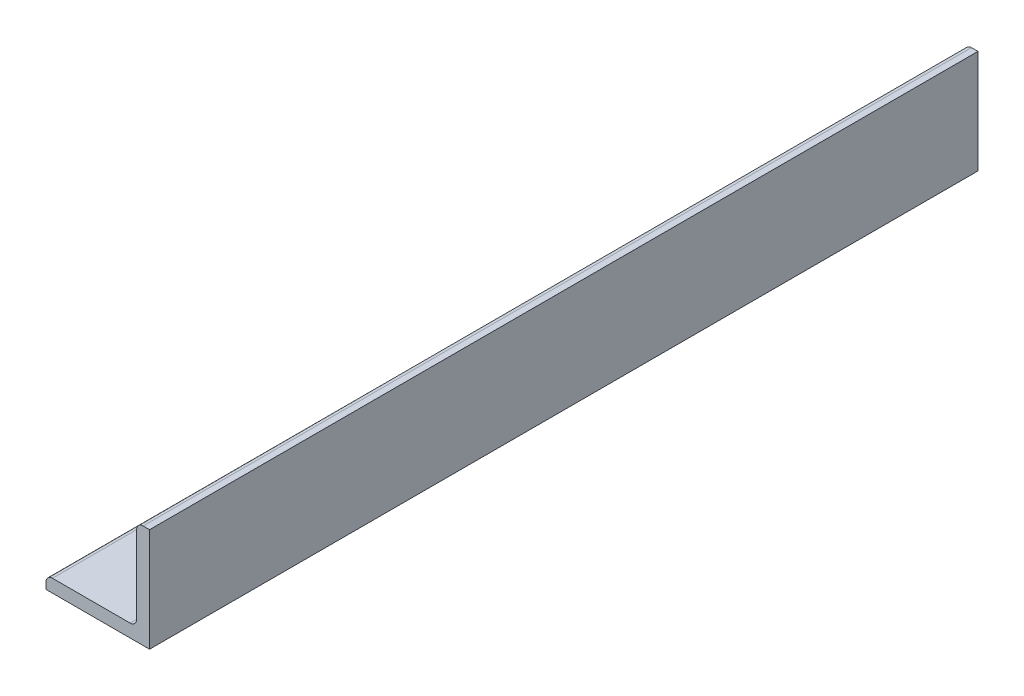
ISO-10303-21;
HEADER;
FILE_DESCRIPTION(('STEP AP214'),'2;1');
FILE_NAME('part.step','',(''),(''),'','','');
FILE_SCHEMA(('AUTOMOTIVE_DESIGN { 1 0 10303 214 1 1 1 1 }'));
ENDSEC;
DATA;
#1=APPLICATION_CONTEXT('core data for automotive mechanical design processes');
#2=APPLICATION_PROTOCOL_DEFINITION('international standard','automotive_design',2000,#1);
#3=PRODUCT_CONTEXT('',#1,'mechanical');
#4=PRODUCT('Part','Part','',(#3));
#5=PRODUCT_RELATED_PRODUCT_CATEGORY('part','',(#4));
#6=PRODUCT_DEFINITION_FORMATION('','',#4);
#7=PRODUCT_DEFINITION_CONTEXT('part definition',#1,'design');
#8=PRODUCT_DEFINITION('design','',#6,#7);
#9=PRODUCT_DEFINITION_SHAPE('','',#8);
#10=(LENGTH_UNIT() NAMED_UNIT(*) SI_UNIT(.MILLI.,.METRE.));
#11=(NAMED_UNIT(*) PLANE_ANGLE_UNIT() SI_UNIT($,.RADIAN.));
#12=(NAMED_UNIT(*) SI_UNIT($,.STERADIAN.) SOLID_ANGLE_UNIT());
#13=UNCERTAINTY_MEASURE_WITH_UNIT(LENGTH_MEASURE(1.E-05),#10,'distance_accuracy_value','');
#14=(GEOMETRIC_REPRESENTATION_CONTEXT(3) GLOBAL_UNCERTAINTY_ASSIGNED_CONTEXT((#13)) GLOBAL_UNIT_ASSIGNED_CONTEXT((#10,
#11,#12)) REPRESENTATION_CONTEXT('',''));
#15=CARTESIAN_POINT('',(0.,0.,0.));
#16=DIRECTION('',(0.,0.,1.));
#17=DIRECTION('',(1.,0.,0.));
#18=AXIS2_PLACEMENT_3D('',#15,#16,#17);
#19=CARTESIAN_POINT('',(-12.7,1.5875,101.6));
#20=DIRECTION('',(1.,0.,0.));
#21=DIRECTION('',(0.,0.,-1.));
#22=AXIS2_PLACEMENT_3D('',#19,#20,#21);
#23=PLANE('',#22);
#24=DIRECTION('',(0.,-1.,0.));
#25=VECTOR('',#24,1.);
#26=CARTESIAN_POINT('',(-12.7,1.5875,-101.6));
#27=LINE('',#26,#25);
#28=CARTESIAN_POINT('',(-12.7,1.5875,-101.6));
#29=VERTEX_POINT('',#28);
#30=CARTESIAN_POINT('',(-12.7,0.,-101.6));
#31=VERTEX_POINT('',#30);
#32=EDGE_CURVE('E146',#29,#31,#27,.T.);
#33=ORIENTED_EDGE('',*,*,#32,.T.);
#34=DIRECTION('',(0.,0.,-1.));
#35=VECTOR('',#34,1.);
#36=CARTESIAN_POINT('',(-12.7,0.,101.6));
#37=LINE('',#36,#35);
#38=CARTESIAN_POINT('',(-12.7,0.,101.6));
#39=VERTEX_POINT('',#38);
#40=EDGE_CURVE('E11',#39,#31,#37,.T.);
#41=ORIENTED_EDGE('',*,*,#40,.F.);
#42=DIRECTION('',(0.,-1.,0.));
#43=VECTOR('',#42,1.);
#44=CARTESIAN_POINT('',(-12.7,1.5875,101.6));
#45=LINE('',#44,#43);
#46=CARTESIAN_POINT('',(-12.7,1.5875,101.6));
#47=VERTEX_POINT('',#46);
#48=EDGE_CURVE('E171',#47,#39,#45,.T.);
#49=ORIENTED_EDGE('',*,*,#48,.F.);
#50=DIRECTION('',(0.,0.,-1.));
#51=VECTOR('',#50,1.);
#52=CARTESIAN_POINT('',(-12.7,1.5875,101.6));
#53=LINE('',#52,#51);
#54=EDGE_CURVE('E142',#47,#29,#53,.T.);
#55=ORIENTED_EDGE('',*,*,#54,.T.);
#56=EDGE_LOOP('',(#33,#41,#49,#55));
#57=FACE_BOUND('',#56,.T.);
#58=ADVANCED_FACE('F39',(#57),#23,.F.);
#59=CARTESIAN_POINT('',(-12.7,0.,101.6));
#60=DIRECTION('',(0.,1.,0.));
#61=DIRECTION('',(0.,0.,1.));
#62=AXIS2_PLACEMENT_3D('',#59,#60,#61);
#63=PLANE('',#62);
#64=DIRECTION('',(1.,0.,0.));
#65=VECTOR('',#64,1.);
#66=CARTESIAN_POINT('',(-12.7,0.,-101.6));
#67=LINE('',#66,#65);
#68=CARTESIAN_POINT('',(12.7,0.,-101.6));
#69=VERTEX_POINT('',#68);
#70=EDGE_CURVE('E150',#31,#69,#67,.T.);
#71=ORIENTED_EDGE('',*,*,#70,.T.);
#72=DIRECTION('',(0.,0.,-1.));
#73=VECTOR('',#72,1.);
#74=CARTESIAN_POINT('',(12.7,0.,101.6));
#75=LINE('',#74,#73);
#76=CARTESIAN_POINT('',(12.7,0.,101.6));
#77=VERTEX_POINT('',#76);
#78=EDGE_CURVE('E48',#77,#69,#75,.T.);
#79=ORIENTED_EDGE('',*,*,#78,.F.);
#80=DIRECTION('',(1.,0.,0.));
#81=VECTOR('',#80,1.);
#82=CARTESIAN_POINT('',(-12.7,0.,101.6));
#83=LINE('',#82,#81);
#84=EDGE_CURVE('E102',#39,#77,#83,.T.);
#85=ORIENTED_EDGE('',*,*,#84,.F.);
#86=ORIENTED_EDGE('',*,*,#40,.T.);
#87=EDGE_LOOP('',(#71,#79,#85,#86));
#88=FACE_BOUND('',#87,.T.);
#89=ADVANCED_FACE('F227',(#88),#63,.F.);
#90=CARTESIAN_POINT('',(12.7,0.,101.6));
#91=DIRECTION('',(-1.,0.,0.));
#92=DIRECTION('',(0.,-1.,0.));
#93=AXIS2_PLACEMENT_3D('',#90,#91,#92);
#94=PLANE('',#93);
#95=DIRECTION('',(0.,1.,0.));
#96=VECTOR('',#95,1.);
#97=CARTESIAN_POINT('',(12.7,0.,-101.6));
#98=LINE('',#97,#96);
#99=CARTESIAN_POINT('',(12.7,25.4,-101.6));
#100=VERTEX_POINT('',#99);
#101=EDGE_CURVE('E153',#69,#100,#98,.T.);
#102=ORIENTED_EDGE('',*,*,#101,.T.);
#103=DIRECTION('',(0.,0.,-1.));
#104=VECTOR('',#103,1.);
#105=CARTESIAN_POINT('',(12.7,25.4,101.6));
#106=LINE('',#105,#104);
#107=CARTESIAN_POINT('',(12.7,25.4,101.6));
#108=VERTEX_POINT('',#107);
#109=EDGE_CURVE('E186',#108,#100,#106,.T.);
#110=ORIENTED_EDGE('',*,*,#109,.F.);
#111=DIRECTION('',(0.,1.,0.));
#112=VECTOR('',#111,1.);
#113=CARTESIAN_POINT('',(12.7,0.,101.6));
#114=LINE('',#113,#112);
#115=EDGE_CURVE('E196',#77,#108,#114,.T.);
#116=ORIENTED_EDGE('',*,*,#115,.F.);
#117=ORIENTED_EDGE('',*,*,#78,.T.);
#118=EDGE_LOOP('',(#102,#110,#116,#117));
#119=FACE_BOUND('',#118,.T.);
#120=ADVANCED_FACE('F194',(#119),#94,.F.);
#121=CARTESIAN_POINT('',(11.1125,25.4,101.6));
#122=DIRECTION('',(0.,-1.,0.));
#123=DIRECTION('',(1.,0.,0.));
#124=AXIS2_PLACEMENT_3D('',#121,#122,#123);
#125=PLANE('',#124);
#126=DIRECTION('',(-1.,0.,0.));
#127=VECTOR('',#126,1.);
#128=CARTESIAN_POINT('',(11.1125,25.4,-101.6));
#129=LINE('',#128,#127);
#130=CARTESIAN_POINT('',(11.1125,25.4,-101.6));
#131=VERTEX_POINT('',#130);
#132=EDGE_CURVE('E156',#100,#131,#129,.T.);
#133=ORIENTED_EDGE('',*,*,#132,.T.);
#134=DIRECTION('',(0.,0.,-1.));
#135=VECTOR('',#134,1.);
#136=CARTESIAN_POINT('',(11.1125,25.4,101.6));
#137=LINE('',#136,#135);
#138=CARTESIAN_POINT('',(11.1125,25.4,101.6));
#139=VERTEX_POINT('',#138);
#140=EDGE_CURVE('E182',#139,#131,#137,.T.);
#141=ORIENTED_EDGE('',*,*,#140,.F.);
#142=DIRECTION('',(-1.,0.,0.));
#143=VECTOR('',#142,1.);
#144=CARTESIAN_POINT('',(11.1125,25.4,101.6));
#145=LINE('',#144,#143);
#146=EDGE_CURVE('E213',#108,#139,#145,.T.);
#147=ORIENTED_EDGE('',*,*,#146,.F.);
#148=ORIENTED_EDGE('',*,*,#109,.T.);
#149=EDGE_LOOP('',(#133,#141,#147,#148));
#150=FACE_BOUND('',#149,.T.);
#151=ADVANCED_FACE('F205',(#150),#125,.F.);
#152=CARTESIAN_POINT('',(11.1125,23.8125,101.6));
#153=DIRECTION('',(0.,0.,-1.));
#154=DIRECTION('',(-1.,0.,0.));
#155=AXIS2_PLACEMENT_3D('',#152,#153,#154);
#156=CYLINDRICAL_SURFACE('',#155,1.5875);
#157=CARTESIAN_POINT('',(11.1125,23.8125,-101.6));
#158=DIRECTION('',(0.,0.,1.));
#159=DIRECTION('',(-1.,0.,0.));
#160=AXIS2_PLACEMENT_3D('',#157,#158,#159);
#161=CIRCLE('',#160,1.5875);
#162=CARTESIAN_POINT('',(9.525,23.8125,-101.6));
#163=VERTEX_POINT('',#162);
#164=EDGE_CURVE('E159',#131,#163,#161,.T.);
#165=ORIENTED_EDGE('',*,*,#164,.T.);
#166=DIRECTION('',(0.,0.,-1.));
#167=VECTOR('',#166,1.);
#168=CARTESIAN_POINT('',(9.525,23.8125,101.6));
#169=LINE('',#168,#167);
#170=CARTESIAN_POINT('',(9.525,23.8125,101.6));
#171=VERTEX_POINT('',#170);
#172=EDGE_CURVE('E178',#171,#163,#169,.T.);
#173=ORIENTED_EDGE('',*,*,#172,.F.);
#174=CARTESIAN_POINT('',(11.1125,23.8125,101.6));
#175=DIRECTION('',(0.,0.,1.));
#176=DIRECTION('',(-1.,0.,0.));
#177=AXIS2_PLACEMENT_3D('',#174,#175,#176);
#178=CIRCLE('',#177,1.5875);
#179=EDGE_CURVE('E211',#139,#171,#178,.T.);
#180=ORIENTED_EDGE('',*,*,#179,.F.);
#181=ORIENTED_EDGE('',*,*,#140,.T.);
#182=EDGE_LOOP('',(#165,#173,#180,#181));
#183=FACE_BOUND('',#182,.T.);
#184=ADVANCED_FACE('F209',(#183),#156,.T.);
#185=CARTESIAN_POINT('',(9.525,23.8125,101.6));
#186=DIRECTION('',(1.,0.,0.));
#187=DIRECTION('',(0.,1.,0.));
#188=AXIS2_PLACEMENT_3D('',#185,#186,#187);
#189=PLANE('',#188);
#190=DIRECTION('',(0.,-1.,0.));
#191=VECTOR('',#190,1.);
#192=CARTESIAN_POINT('',(9.525,23.8125,-101.6));
#193=LINE('',#192,#191);
#194=CARTESIAN_POINT('',(9.525,4.7625,-101.6));
#195=VERTEX_POINT('',#194);
#196=EDGE_CURVE('E162',#163,#195,#193,.T.);
#197=ORIENTED_EDGE('',*,*,#196,.T.);
#198=DIRECTION('',(0.,0.,-1.));
#199=VECTOR('',#198,1.);
#200=CARTESIAN_POINT('',(9.525,4.7625,101.6));
#201=LINE('',#200,#199);
#202=CARTESIAN_POINT('',(9.525,4.7625,101.6));
#203=VERTEX_POINT('',#202);
#204=EDGE_CURVE('E135',#203,#195,#201,.T.);
#205=ORIENTED_EDGE('',*,*,#204,.F.);
#206=DIRECTION('',(0.,-1.,0.));
#207=VECTOR('',#206,1.);
#208=CARTESIAN_POINT('',(9.525,23.8125,101.6));
#209=LINE('',#208,#207);
#210=EDGE_CURVE('E124',#171,#203,#209,.T.);
#211=ORIENTED_EDGE('',*,*,#210,.F.);
#212=ORIENTED_EDGE('',*,*,#172,.T.);
#213=EDGE_LOOP('',(#197,#205,#211,#212));
#214=FACE_BOUND('',#213,.T.);
#215=ADVANCED_FACE('F239',(#214),#189,.F.);
#216=CARTESIAN_POINT('',(7.93750000000001,4.7625,101.6));
#217=DIRECTION('',(0.,0.,-1.));
#218=DIRECTION('',(-1.,0.,0.));
#219=AXIS2_PLACEMENT_3D('',#216,#217,#218);
#220=CYLINDRICAL_SURFACE('',#219,1.5875);
#221=CARTESIAN_POINT('',(7.93750000000001,4.7625,-101.6));
#222=DIRECTION('',(0.,0.,-1.));
#223=DIRECTION('',(-1.,0.,0.));
#224=AXIS2_PLACEMENT_3D('',#221,#222,#223);
#225=CIRCLE('',#224,1.5875);
#226=CARTESIAN_POINT('',(7.9375,3.175,-101.6));
#227=VERTEX_POINT('',#226);
#228=EDGE_CURVE('E133',#195,#227,#225,.T.);
#229=ORIENTED_EDGE('',*,*,#228,.T.);
#230=DIRECTION('',(0.,0.,-1.));
#231=VECTOR('',#230,1.);
#232=CARTESIAN_POINT('',(7.9375,3.175,101.6));
#233=LINE('',#232,#231);
#234=CARTESIAN_POINT('',(7.9375,3.175,101.6));
#235=VERTEX_POINT('',#234);
#236=EDGE_CURVE('E130',#235,#227,#233,.T.);
#237=ORIENTED_EDGE('',*,*,#236,.F.);
#238=CARTESIAN_POINT('',(7.93750000000001,4.7625,101.6));
#239=DIRECTION('',(0.,0.,-1.));
#240=DIRECTION('',(-1.,0.,0.));
#241=AXIS2_PLACEMENT_3D('',#238,#239,#240);
#242=CIRCLE('',#241,1.5875);
#243=EDGE_CURVE('E118',#203,#235,#242,.T.);
#244=ORIENTED_EDGE('',*,*,#243,.F.);
#245=ORIENTED_EDGE('',*,*,#204,.T.);
#246=EDGE_LOOP('',(#229,#237,#244,#245));
#247=FACE_BOUND('',#246,.T.);
#248=ADVANCED_FACE('F131',(#247),#220,.F.);
#249=CARTESIAN_POINT('',(7.9375,3.175,101.6));
#250=DIRECTION('',(0.,-1.,0.));
#251=DIRECTION('',(1.,0.,0.));
#252=AXIS2_PLACEMENT_3D('',#249,#250,#251);
#253=PLANE('',#252);
#254=DIRECTION('',(-1.,0.,0.));
#255=VECTOR('',#254,1.);
#256=CARTESIAN_POINT('',(7.9375,3.175,-101.6));
#257=LINE('',#256,#255);
#258=CARTESIAN_POINT('',(-11.1125,3.175,-101.6));
#259=VERTEX_POINT('',#258);
#260=EDGE_CURVE('E88',#227,#259,#257,.T.);
#261=ORIENTED_EDGE('',*,*,#260,.T.);
#262=DIRECTION('',(0.,0.,-1.));
#263=VECTOR('',#262,1.);
#264=CARTESIAN_POINT('',(-11.1125,3.175,101.6));
#265=LINE('',#264,#263);
#266=CARTESIAN_POINT('',(-11.1125,3.175,101.6));
#267=VERTEX_POINT('',#266);
#268=EDGE_CURVE('E136',#267,#259,#265,.T.);
#269=ORIENTED_EDGE('',*,*,#268,.F.);
#270=DIRECTION('',(-1.,0.,0.));
#271=VECTOR('',#270,1.);
#272=CARTESIAN_POINT('',(7.9375,3.175,101.6));
#273=LINE('',#272,#271);
#274=EDGE_CURVE('E122',#235,#267,#273,.T.);
#275=ORIENTED_EDGE('',*,*,#274,.F.);
#276=ORIENTED_EDGE('',*,*,#236,.T.);
#277=EDGE_LOOP('',(#261,#269,#275,#276));
#278=FACE_BOUND('',#277,.T.);
#279=ADVANCED_FACE('F138',(#278),#253,.F.);
#280=CARTESIAN_POINT('',(-11.1125,1.5875,101.6));
#281=DIRECTION('',(0.,0.,-1.));
#282=DIRECTION('',(-1.,0.,0.));
#283=AXIS2_PLACEMENT_3D('',#280,#281,#282);
#284=CYLINDRICAL_SURFACE('',#283,1.5875);
#285=CARTESIAN_POINT('',(-11.1125,1.5875,-101.6));
#286=DIRECTION('',(0.,0.,1.));
#287=DIRECTION('',(-1.,0.,0.));
#288=AXIS2_PLACEMENT_3D('',#285,#286,#287);
#289=CIRCLE('',#288,1.5875);
#290=EDGE_CURVE('E94',#259,#29,#289,.T.);
#291=ORIENTED_EDGE('',*,*,#290,.T.);
#292=ORIENTED_EDGE('',*,*,#54,.F.);
#293=CARTESIAN_POINT('',(-11.1125,1.5875,101.6));
#294=DIRECTION('',(0.,0.,1.));
#295=DIRECTION('',(-1.,0.,0.));
#296=AXIS2_PLACEMENT_3D('',#293,#294,#295);
#297=CIRCLE('',#296,1.5875);
#298=EDGE_CURVE('E56',#267,#47,#297,.T.);
#299=ORIENTED_EDGE('',*,*,#298,.F.);
#300=ORIENTED_EDGE('',*,*,#268,.T.);
#301=EDGE_LOOP('',(#291,#292,#299,#300));
#302=FACE_BOUND('',#301,.T.);
#303=ADVANCED_FACE('F247',(#302),#284,.T.);
#304=CARTESIAN_POINT('',(11.1125,23.8125,101.6));
#305=DIRECTION('',(0.,0.,-1.));
#306=DIRECTION('',(-1.,0.,0.));
#307=AXIS2_PLACEMENT_3D('',#304,#305,#306);
#308=PLANE('',#307);
#309=ORIENTED_EDGE('',*,*,#48,.T.);
#310=ORIENTED_EDGE('',*,*,#84,.T.);
#311=ORIENTED_EDGE('',*,*,#115,.T.);
#312=ORIENTED_EDGE('',*,*,#146,.T.);
#313=ORIENTED_EDGE('',*,*,#179,.T.);
#314=ORIENTED_EDGE('',*,*,#210,.T.);
#315=ORIENTED_EDGE('',*,*,#243,.T.);
#316=ORIENTED_EDGE('',*,*,#274,.T.);
#317=ORIENTED_EDGE('',*,*,#298,.T.);
#318=EDGE_LOOP('',(#309,#310,#311,#312,#313,#314,#315,#316,#317));
#319=FACE_BOUND('',#318,.T.);
#320=ADVANCED_FACE('F120',(#319),#308,.F.);
#321=CARTESIAN_POINT('',(11.1125,23.8125,-101.6));
#322=DIRECTION('',(0.,0.,-1.));
#323=DIRECTION('',(-1.,0.,0.));
#324=AXIS2_PLACEMENT_3D('',#321,#322,#323);
#325=PLANE('',#324);
#326=ORIENTED_EDGE('',*,*,#32,.F.);
#327=ORIENTED_EDGE('',*,*,#290,.F.);
#328=ORIENTED_EDGE('',*,*,#260,.F.);
#329=ORIENTED_EDGE('',*,*,#228,.F.);
#330=ORIENTED_EDGE('',*,*,#196,.F.);
#331=ORIENTED_EDGE('',*,*,#164,.F.);
#332=ORIENTED_EDGE('',*,*,#132,.F.);
#333=ORIENTED_EDGE('',*,*,#101,.F.);
#334=ORIENTED_EDGE('',*,*,#70,.F.);
#335=EDGE_LOOP('',(#326,#327,#328,#329,#330,#331,#332,#333,#334));
#336=FACE_BOUND('',#335,.T.);
#337=ADVANCED_FACE('F200',(#336),#325,.T.);
#338=CLOSED_SHELL('',(#58,#89,#120,#151,#184,#215,#248,#279,#303,#320,#337));
#339=MANIFOLD_SOLID_BREP('B2',#338);
#340=ADVANCED_BREP_SHAPE_REPRESENTATION('',(#18,#339),#14);
#341=SHAPE_DEFINITION_REPRESENTATION(#9,#340);
ENDSEC;
END-ISO-10303-21;
